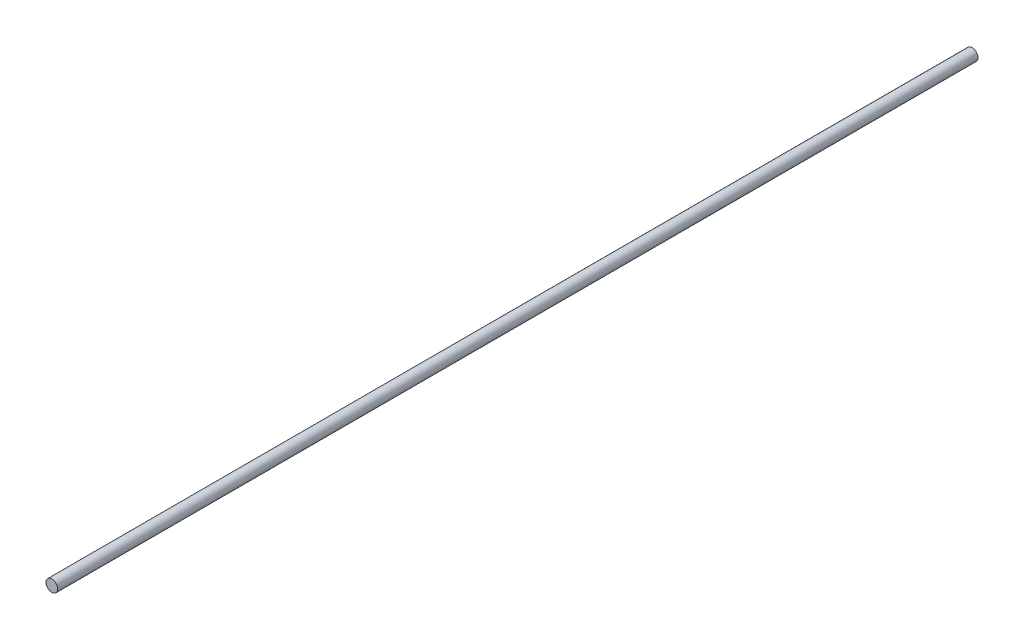
ISO-10303-21;
HEADER;
FILE_DESCRIPTION(('STEP AP214'),'2;1');
FILE_NAME('part.step','',(''),(''),'','','');
FILE_SCHEMA(('AUTOMOTIVE_DESIGN { 1 0 10303 214 1 1 1 1 }'));
ENDSEC;
DATA;
#1=APPLICATION_CONTEXT('core data for automotive mechanical design processes');
#2=APPLICATION_PROTOCOL_DEFINITION('international standard','automotive_design',2000,#1);
#3=PRODUCT_CONTEXT('',#1,'mechanical');
#4=PRODUCT('Part','Part','',(#3));
#5=PRODUCT_RELATED_PRODUCT_CATEGORY('part','',(#4));
#6=PRODUCT_DEFINITION_FORMATION('','',#4);
#7=PRODUCT_DEFINITION_CONTEXT('part definition',#1,'design');
#8=PRODUCT_DEFINITION('design','',#6,#7);
#9=PRODUCT_DEFINITION_SHAPE('','',#8);
#10=(LENGTH_UNIT() NAMED_UNIT(*) SI_UNIT(.MILLI.,.METRE.));
#11=(NAMED_UNIT(*) PLANE_ANGLE_UNIT() SI_UNIT($,.RADIAN.));
#12=(NAMED_UNIT(*) SI_UNIT($,.STERADIAN.) SOLID_ANGLE_UNIT());
#13=UNCERTAINTY_MEASURE_WITH_UNIT(LENGTH_MEASURE(1.E-05),#10,'distance_accuracy_value','');
#14=(GEOMETRIC_REPRESENTATION_CONTEXT(3) GLOBAL_UNCERTAINTY_ASSIGNED_CONTEXT((#13)) GLOBAL_UNIT_ASSIGNED_CONTEXT((#10,
#11,#12)) REPRESENTATION_CONTEXT('',''));
#15=CARTESIAN_POINT('',(0.,0.,0.));
#16=DIRECTION('',(0.,0.,1.));
#17=DIRECTION('',(1.,0.,0.));
#18=AXIS2_PLACEMENT_3D('',#15,#16,#17);
#19=CARTESIAN_POINT('',(0.,0.,500.));
#20=DIRECTION('',(0.,0.,-1.));
#21=DIRECTION('',(-1.,0.,0.));
#22=AXIS2_PLACEMENT_3D('',#19,#20,#21);
#23=CYLINDRICAL_SURFACE('',#22,3.175);
#24=CARTESIAN_POINT('',(0.,0.,500.));
#25=DIRECTION('',(0.,0.,1.));
#26=DIRECTION('',(1.,0.,0.));
#27=AXIS2_PLACEMENT_3D('',#24,#25,#26);
#28=CIRCLE('',#27,3.175);
#29=CARTESIAN_POINT('',(3.175,0.,500.));
#30=VERTEX_POINT('',#29);
#31=EDGE_CURVE('E10',#30,#30,#28,.T.);
#32=ORIENTED_EDGE('',*,*,#31,.F.);
#33=EDGE_LOOP('',(#32));
#34=FACE_BOUND('',#33,.T.);
#35=CARTESIAN_POINT('',(0.,0.,0.));
#36=DIRECTION('',(0.,0.,1.));
#37=DIRECTION('',(1.,0.,0.));
#38=AXIS2_PLACEMENT_3D('',#35,#36,#37);
#39=CIRCLE('',#38,3.175);
#40=CARTESIAN_POINT('',(3.175,0.,0.));
#41=VERTEX_POINT('',#40);
#42=EDGE_CURVE('E46',#41,#41,#39,.T.);
#43=ORIENTED_EDGE('',*,*,#42,.T.);
#44=EDGE_LOOP('',(#43));
#45=FACE_BOUND('',#44,.T.);
#46=ADVANCED_FACE('F43',(#34,#45),#23,.T.);
#47=CARTESIAN_POINT('',(0.,0.,500.));
#48=DIRECTION('',(0.,0.,1.));
#49=DIRECTION('',(1.,0.,0.));
#50=AXIS2_PLACEMENT_3D('',#47,#48,#49);
#51=PLANE('',#50);
#52=ORIENTED_EDGE('',*,*,#31,.T.);
#53=EDGE_LOOP('',(#52));
#54=FACE_BOUND('',#53,.T.);
#55=ADVANCED_FACE('F60',(#54),#51,.T.);
#56=CARTESIAN_POINT('',(0.,0.,0.));
#57=DIRECTION('',(0.,0.,1.));
#58=DIRECTION('',(1.,0.,0.));
#59=AXIS2_PLACEMENT_3D('',#56,#57,#58);
#60=PLANE('',#59);
#61=ORIENTED_EDGE('',*,*,#42,.F.);
#62=EDGE_LOOP('',(#61));
#63=FACE_BOUND('',#62,.T.);
#64=ADVANCED_FACE('F58',(#63),#60,.F.);
#65=CLOSED_SHELL('',(#46,#55,#64));
#66=MANIFOLD_SOLID_BREP('B2',#65);
#67=ADVANCED_BREP_SHAPE_REPRESENTATION('',(#18,#66),#14);
#68=SHAPE_DEFINITION_REPRESENTATION(#9,#67);
ENDSEC;
END-ISO-10303-21;
